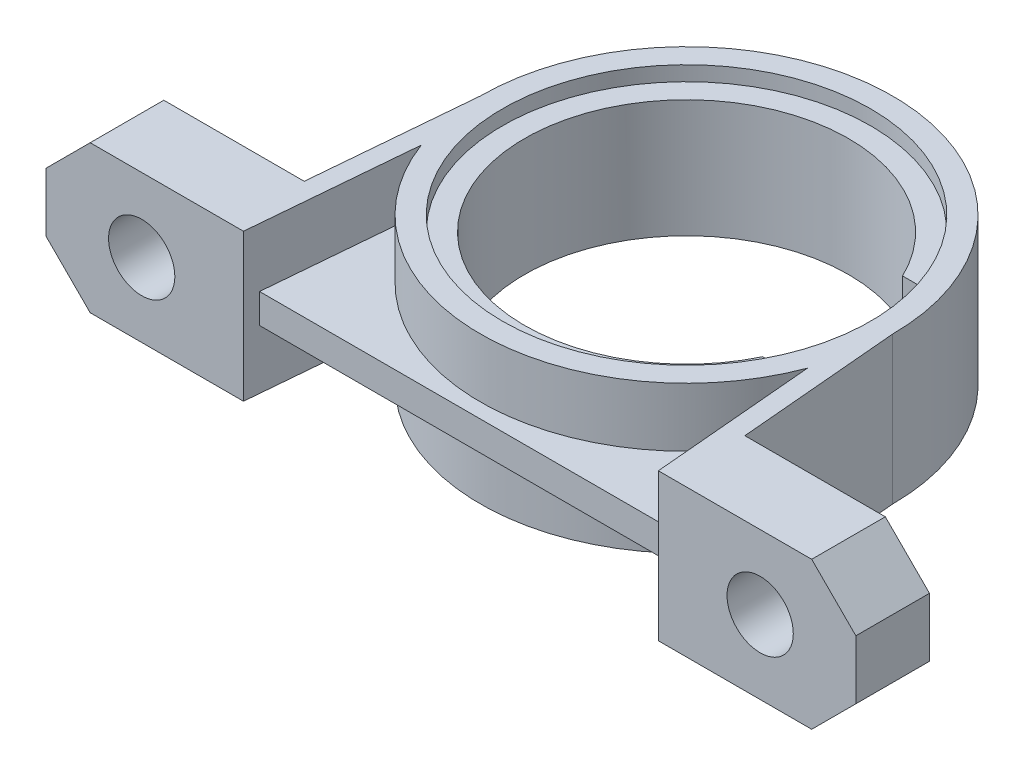
ISO-10303-21;
HEADER;
FILE_DESCRIPTION(('STEP AP214'),'2;1');
FILE_NAME('part.step','',(''),(''),'','','');
FILE_SCHEMA(('AUTOMOTIVE_DESIGN { 1 0 10303 214 1 1 1 1 }'));
ENDSEC;
DATA;
#1=APPLICATION_CONTEXT('core data for automotive mechanical design processes');
#2=APPLICATION_PROTOCOL_DEFINITION('international standard','automotive_design',2000,#1);
#3=PRODUCT_CONTEXT('',#1,'mechanical');
#4=PRODUCT('Part','Part','',(#3));
#5=PRODUCT_RELATED_PRODUCT_CATEGORY('part','',(#4));
#6=PRODUCT_DEFINITION_FORMATION('','',#4);
#7=PRODUCT_DEFINITION_CONTEXT('part definition',#1,'design');
#8=PRODUCT_DEFINITION('design','',#6,#7);
#9=PRODUCT_DEFINITION_SHAPE('','',#8);
#10=(LENGTH_UNIT() NAMED_UNIT(*) SI_UNIT(.MILLI.,.METRE.));
#11=(NAMED_UNIT(*) PLANE_ANGLE_UNIT() SI_UNIT($,.RADIAN.));
#12=(NAMED_UNIT(*) SI_UNIT($,.STERADIAN.) SOLID_ANGLE_UNIT());
#13=UNCERTAINTY_MEASURE_WITH_UNIT(LENGTH_MEASURE(1.E-05),#10,'distance_accuracy_value','');
#14=(GEOMETRIC_REPRESENTATION_CONTEXT(3) GLOBAL_UNCERTAINTY_ASSIGNED_CONTEXT((#13)) GLOBAL_UNIT_ASSIGNED_CONTEXT((#10,
#11,#12)) REPRESENTATION_CONTEXT('',''));
#15=CARTESIAN_POINT('',(0.,0.,0.));
#16=DIRECTION('',(0.,0.,1.));
#17=DIRECTION('',(1.,0.,0.));
#18=AXIS2_PLACEMENT_3D('',#15,#16,#17);
#19=CARTESIAN_POINT('',(-14.,10.,-0.999999999999998));
#20=DIRECTION('',(0.,0.,-1.));
#21=DIRECTION('',(-1.,0.,0.));
#22=AXIS2_PLACEMENT_3D('',#19,#20,#21);
#23=PLANE('',#22);
#24=DIRECTION('',(-1.,0.,0.));
#25=VECTOR('',#24,1.);
#26=CARTESIAN_POINT('',(14.,4.,-0.999999999999998));
#27=LINE('',#26,#25);
#28=CARTESIAN_POINT('',(14.,4.,-0.999999999999998));
#29=VERTEX_POINT('',#28);
#30=CARTESIAN_POINT('',(-14.,4.,-0.999999999999998));
#31=VERTEX_POINT('',#30);
#32=EDGE_CURVE('E213',#29,#31,#27,.T.);
#33=ORIENTED_EDGE('',*,*,#32,.F.);
#34=DIRECTION('',(0.,-1.,0.));
#35=VECTOR('',#34,1.);
#36=CARTESIAN_POINT('',(14.,10.,-0.999999999999998));
#37=LINE('',#36,#35);
#38=CARTESIAN_POINT('',(14.,6.,-0.999999999999998));
#39=VERTEX_POINT('',#38);
#40=EDGE_CURVE('E227',#39,#29,#37,.T.);
#41=ORIENTED_EDGE('',*,*,#40,.F.);
#42=DIRECTION('',(1.,0.,0.));
#43=VECTOR('',#42,1.);
#44=CARTESIAN_POINT('',(-14.,6.,-0.999999999999998));
#45=LINE('',#44,#43);
#46=CARTESIAN_POINT('',(-14.,6.,-0.999999999999998));
#47=VERTEX_POINT('',#46);
#48=EDGE_CURVE('E225',#47,#39,#45,.T.);
#49=ORIENTED_EDGE('',*,*,#48,.F.);
#50=DIRECTION('',(0.,-1.,0.));
#51=VECTOR('',#50,1.);
#52=CARTESIAN_POINT('',(-14.,10.,-0.999999999999998));
#53=LINE('',#52,#51);
#54=EDGE_CURVE('E206',#47,#31,#53,.T.);
#55=ORIENTED_EDGE('',*,*,#54,.T.);
#56=EDGE_LOOP('',(#33,#41,#49,#55));
#57=FACE_BOUND('',#56,.T.);
#58=ADVANCED_FACE('F37',(#57),#23,.F.);
#59=CARTESIAN_POINT('',(0.,0.,-16.));
#60=DIRECTION('',(0.,1.,0.));
#61=DIRECTION('',(0.,0.,1.));
#62=AXIS2_PLACEMENT_3D('',#59,#60,#61);
#63=CYLINDRICAL_SURFACE('',#62,11.);
#64=CARTESIAN_POINT('',(0.,9.,-16.));
#65=DIRECTION('',(0.,1.,0.));
#66=DIRECTION('',(0.,0.,1.));
#67=AXIS2_PLACEMENT_3D('',#64,#65,#66);
#68=CIRCLE('',#67,11.);
#69=CARTESIAN_POINT('',(9.92156741649221,9.,-11.25));
#70=VERTEX_POINT('',#69);
#71=CARTESIAN_POINT('',(9.92156741649221,9.,-20.75));
#72=VERTEX_POINT('',#71);
#73=EDGE_CURVE('E251',#70,#72,#68,.F.);
#74=ORIENTED_EDGE('',*,*,#73,.F.);
#75=DIRECTION('',(0.,1.,0.));
#76=VECTOR('',#75,1.);
#77=CARTESIAN_POINT('',(9.92156741649221,4.,-11.25));
#78=LINE('',#77,#76);
#79=CARTESIAN_POINT('',(9.92156741649221,4.,-11.25));
#80=VERTEX_POINT('',#79);
#81=EDGE_CURVE('E423',#80,#70,#78,.T.);
#82=ORIENTED_EDGE('',*,*,#81,.F.);
#83=CARTESIAN_POINT('',(0.,4.,-16.));
#84=DIRECTION('',(0.,-1.,0.));
#85=DIRECTION('',(0.,0.,-1.));
#86=AXIS2_PLACEMENT_3D('',#83,#84,#85);
#87=CIRCLE('',#86,11.);
#88=CARTESIAN_POINT('',(9.92156741649221,4.,-20.75));
#89=VERTEX_POINT('',#88);
#90=EDGE_CURVE('E414',#89,#80,#87,.T.);
#91=ORIENTED_EDGE('',*,*,#90,.F.);
#92=DIRECTION('',(0.,1.,0.));
#93=VECTOR('',#92,1.);
#94=CARTESIAN_POINT('',(9.92156741649221,4.,-20.75));
#95=LINE('',#94,#93);
#96=EDGE_CURVE('E425',#89,#72,#95,.T.);
#97=ORIENTED_EDGE('',*,*,#96,.T.);
#98=EDGE_LOOP('',(#74,#82,#91,#97));
#99=FACE_BOUND('',#98,.T.);
#100=CARTESIAN_POINT('',(0.,1.,-16.));
#101=DIRECTION('',(0.,-1.,0.));
#102=DIRECTION('',(0.,0.,-1.));
#103=AXIS2_PLACEMENT_3D('',#100,#101,#102);
#104=CIRCLE('',#103,11.);
#105=CARTESIAN_POINT('',(0.,1.,-27.));
#106=VERTEX_POINT('',#105);
#107=EDGE_CURVE('E41',#106,#106,#104,.F.);
#108=ORIENTED_EDGE('',*,*,#107,.F.);
#109=EDGE_LOOP('',(#108));
#110=FACE_BOUND('',#109,.T.);
#111=ADVANCED_FACE('F449',(#99,#110),#63,.F.);
#112=CARTESIAN_POINT('',(27.5,10.,0.));
#113=DIRECTION('',(-1.,0.,0.));
#114=DIRECTION('',(0.,0.,1.));
#115=AXIS2_PLACEMENT_3D('',#112,#113,#114);
#116=PLANE('',#115);
#117=DIRECTION('',(0.,-1.,0.));
#118=VECTOR('',#117,1.);
#119=CARTESIAN_POINT('',(27.5,10.,-5.));
#120=LINE('',#119,#118);
#121=CARTESIAN_POINT('',(27.5,7.00000000000006,-5.00000000000001));
#122=VERTEX_POINT('',#121);
#123=CARTESIAN_POINT('',(27.5,2.99999999999992,-5.00000000000001));
#124=VERTEX_POINT('',#123);
#125=EDGE_CURVE('E11',#122,#124,#120,.T.);
#126=ORIENTED_EDGE('',*,*,#125,.F.);
#127=DIRECTION('',(0.,0.,1.));
#128=VECTOR('',#127,1.);
#129=CARTESIAN_POINT('',(27.5,7.00000000000006,-11.3639610306789));
#130=LINE('',#129,#128);
#131=CARTESIAN_POINT('',(27.5,7.00000000000006,0.));
#132=VERTEX_POINT('',#131);
#133=EDGE_CURVE('E290',#122,#132,#130,.T.);
#134=ORIENTED_EDGE('',*,*,#133,.T.);
#135=DIRECTION('',(0.,-1.,0.));
#136=VECTOR('',#135,1.);
#137=CARTESIAN_POINT('',(27.5,10.,0.));
#138=LINE('',#137,#136);
#139=CARTESIAN_POINT('',(27.5,2.99999999999992,0.));
#140=VERTEX_POINT('',#139);
#141=EDGE_CURVE('E336',#132,#140,#138,.T.);
#142=ORIENTED_EDGE('',*,*,#141,.T.);
#143=DIRECTION('',(0.,0.,1.));
#144=VECTOR('',#143,1.);
#145=CARTESIAN_POINT('',(27.5,2.99999999999992,-11.3639610306789));
#146=LINE('',#145,#144);
#147=EDGE_CURVE('E270',#124,#140,#146,.T.);
#148=ORIENTED_EDGE('',*,*,#147,.F.);
#149=EDGE_LOOP('',(#126,#134,#142,#148));
#150=FACE_BOUND('',#149,.T.);
#151=ADVANCED_FACE('F39',(#150),#116,.F.);
#152=CARTESIAN_POINT('',(14.9623752987852,10.,-5.));
#153=DIRECTION('',(0.,0.,1.));
#154=DIRECTION('',(1.,0.,0.));
#155=AXIS2_PLACEMENT_3D('',#152,#153,#154);
#156=PLANE('',#155);
#157=CARTESIAN_POINT('',(21.,5.,-5.00000000000001));
#158=DIRECTION('',(0.,0.,1.));
#159=DIRECTION('',(1.,0.,0.));
#160=AXIS2_PLACEMENT_3D('',#157,#158,#159);
#161=CIRCLE('',#160,2.25);
#162=CARTESIAN_POINT('',(23.25,5.,-5.00000000000001));
#163=VERTEX_POINT('',#162);
#164=EDGE_CURVE('E295',#163,#163,#161,.F.);
#165=ORIENTED_EDGE('',*,*,#164,.F.);
#166=EDGE_LOOP('',(#165));
#167=FACE_BOUND('',#166,.T.);
#168=DIRECTION('',(-1.,0.,0.));
#169=VECTOR('',#168,1.);
#170=CARTESIAN_POINT('',(14.9623752987852,10.,-5.));
#171=LINE('',#170,#169);
#172=CARTESIAN_POINT('',(24.5,10.,-5.));
#173=VERTEX_POINT('',#172);
#174=CARTESIAN_POINT('',(14.9623752987852,10.,-5.));
#175=VERTEX_POINT('',#174);
#176=EDGE_CURVE('E316',#173,#175,#171,.T.);
#177=ORIENTED_EDGE('',*,*,#176,.F.);
#178=DIRECTION('',(-0.707106781186556,0.707106781186539,0.));
#179=VECTOR('',#178,1.);
#180=CARTESIAN_POINT('',(27.5,7.00000000000006,-5.00000000000001));
#181=LINE('',#180,#179);
#182=EDGE_CURVE('E276',#122,#173,#181,.T.);
#183=ORIENTED_EDGE('',*,*,#182,.F.);
#184=ORIENTED_EDGE('',*,*,#125,.T.);
#185=DIRECTION('',(0.707106781186556,0.707106781186539,0.));
#186=VECTOR('',#185,1.);
#187=CARTESIAN_POINT('',(27.5,2.99999999999992,-5.00000000000001));
#188=LINE('',#187,#186);
#189=CARTESIAN_POINT('',(24.5,0.,-5.00000000000001));
#190=VERTEX_POINT('',#189);
#191=EDGE_CURVE('E253',#190,#124,#188,.T.);
#192=ORIENTED_EDGE('',*,*,#191,.F.);
#193=DIRECTION('',(-1.,0.,0.));
#194=VECTOR('',#193,1.);
#195=CARTESIAN_POINT('',(14.9623752987852,0.,-5.));
#196=LINE('',#195,#194);
#197=CARTESIAN_POINT('',(14.9623752987852,0.,-5.));
#198=VERTEX_POINT('',#197);
#199=EDGE_CURVE('E315',#190,#198,#196,.T.);
#200=ORIENTED_EDGE('',*,*,#199,.T.);
#201=DIRECTION('',(0.,-1.,0.));
#202=VECTOR('',#201,1.);
#203=CARTESIAN_POINT('',(14.9623752987852,10.,-5.));
#204=LINE('',#203,#202);
#205=EDGE_CURVE('E46',#175,#198,#204,.T.);
#206=ORIENTED_EDGE('',*,*,#205,.F.);
#207=EDGE_LOOP('',(#177,#183,#184,#192,#200,#206));
#208=FACE_BOUND('',#207,.T.);
#209=ADVANCED_FACE('F378',(#167,#208),#156,.F.);
#210=CARTESIAN_POINT('',(14.,10.,-16.));
#211=DIRECTION('',(-0.996194698091746,0.,0.0871557427476584));
#212=DIRECTION('',(0.0871557427476584,0.,0.996194698091746));
#213=AXIS2_PLACEMENT_3D('',#210,#211,#212);
#214=PLANE('',#213);
#215=DIRECTION('',(-0.0871557427476584,0.,-0.996194698091745));
#216=VECTOR('',#215,1.);
#217=CARTESIAN_POINT('',(14.,0.,-16.));
#218=LINE('',#217,#216);
#219=CARTESIAN_POINT('',(14.,0.,-16.));
#220=VERTEX_POINT('',#219);
#221=EDGE_CURVE('E338',#198,#220,#218,.T.);
#222=ORIENTED_EDGE('',*,*,#221,.T.);
#223=DIRECTION('',(0.,-1.,0.));
#224=VECTOR('',#223,1.);
#225=CARTESIAN_POINT('',(14.,10.,-16.));
#226=LINE('',#225,#224);
#227=CARTESIAN_POINT('',(14.,10.,-16.));
#228=VERTEX_POINT('',#227);
#229=EDGE_CURVE('E247',#228,#220,#226,.T.);
#230=ORIENTED_EDGE('',*,*,#229,.F.);
#231=DIRECTION('',(-0.0871557427476584,0.,-0.996194698091745));
#232=VECTOR('',#231,1.);
#233=CARTESIAN_POINT('',(14.,10.,-16.));
#234=LINE('',#233,#232);
#235=EDGE_CURVE('E318',#175,#228,#234,.T.);
#236=ORIENTED_EDGE('',*,*,#235,.F.);
#237=ORIENTED_EDGE('',*,*,#205,.T.);
#238=EDGE_LOOP('',(#222,#230,#236,#237));
#239=FACE_BOUND('',#238,.T.);
#240=ADVANCED_FACE('F479',(#239),#214,.F.);
#241=CARTESIAN_POINT('',(0.,10.,-16.));
#242=DIRECTION('',(0.,-1.,0.));
#243=DIRECTION('',(0.,0.,-1.));
#244=AXIS2_PLACEMENT_3D('',#241,#242,#243);
#245=CYLINDRICAL_SURFACE('',#244,14.);
#246=CARTESIAN_POINT('',(0.,0.,-16.));
#247=DIRECTION('',(0.,1.,0.));
#248=DIRECTION('',(0.,0.,1.));
#249=AXIS2_PLACEMENT_3D('',#246,#247,#248);
#250=CIRCLE('',#249,14.);
#251=CARTESIAN_POINT('',(-14.,0.,-16.));
#252=VERTEX_POINT('',#251);
#253=EDGE_CURVE('E340',#220,#252,#250,.T.);
#254=ORIENTED_EDGE('',*,*,#253,.T.);
#255=DIRECTION('',(0.,-1.,0.));
#256=VECTOR('',#255,1.);
#257=CARTESIAN_POINT('',(-14.,10.,-16.));
#258=LINE('',#257,#256);
#259=CARTESIAN_POINT('',(-14.,10.,-16.));
#260=VERTEX_POINT('',#259);
#261=EDGE_CURVE('E244',#260,#252,#258,.T.);
#262=ORIENTED_EDGE('',*,*,#261,.F.);
#263=CARTESIAN_POINT('',(0.,10.,-16.));
#264=DIRECTION('',(0.,1.,0.));
#265=DIRECTION('',(0.,0.,1.));
#266=AXIS2_PLACEMENT_3D('',#263,#264,#265);
#267=CIRCLE('',#266,14.);
#268=EDGE_CURVE('E321',#228,#260,#267,.T.);
#269=ORIENTED_EDGE('',*,*,#268,.F.);
#270=ORIENTED_EDGE('',*,*,#229,.T.);
#271=EDGE_LOOP('',(#254,#262,#269,#270));
#272=FACE_BOUND('',#271,.T.);
#273=ADVANCED_FACE('F475',(#272),#245,.T.);
#274=CARTESIAN_POINT('',(-14.,10.,-16.));
#275=DIRECTION('',(0.996194698091746,0.,0.0871557427476584));
#276=DIRECTION('',(0.0871557427476584,0.,-0.996194698091746));
#277=AXIS2_PLACEMENT_3D('',#274,#275,#276);
#278=PLANE('',#277);
#279=DIRECTION('',(-0.0871557427476584,0.,0.996194698091745));
#280=VECTOR('',#279,1.);
#281=CARTESIAN_POINT('',(-14.,0.,-16.));
#282=LINE('',#281,#280);
#283=CARTESIAN_POINT('',(-14.9623752987852,0.,-5.));
#284=VERTEX_POINT('',#283);
#285=EDGE_CURVE('E342',#252,#284,#282,.T.);
#286=ORIENTED_EDGE('',*,*,#285,.T.);
#287=DIRECTION('',(0.,-1.,0.));
#288=VECTOR('',#287,1.);
#289=CARTESIAN_POINT('',(-14.9623752987852,10.,-5.));
#290=LINE('',#289,#288);
#291=CARTESIAN_POINT('',(-14.9623752987852,10.,-5.));
#292=VERTEX_POINT('',#291);
#293=EDGE_CURVE('E241',#292,#284,#290,.T.);
#294=ORIENTED_EDGE('',*,*,#293,.F.);
#295=DIRECTION('',(-0.0871557427476584,0.,0.996194698091745));
#296=VECTOR('',#295,1.);
#297=CARTESIAN_POINT('',(-14.,10.,-16.));
#298=LINE('',#297,#296);
#299=EDGE_CURVE('E323',#260,#292,#298,.T.);
#300=ORIENTED_EDGE('',*,*,#299,.F.);
#301=ORIENTED_EDGE('',*,*,#261,.T.);
#302=EDGE_LOOP('',(#286,#294,#300,#301));
#303=FACE_BOUND('',#302,.T.);
#304=ADVANCED_FACE('F471',(#303),#278,.F.);
#305=CARTESIAN_POINT('',(-27.5,10.,-5.));
#306=DIRECTION('',(0.,0.,1.));
#307=DIRECTION('',(1.,0.,0.));
#308=AXIS2_PLACEMENT_3D('',#305,#306,#307);
#309=PLANE('',#308);
#310=CARTESIAN_POINT('',(-21.,5.,-5.));
#311=DIRECTION('',(0.,0.,1.));
#312=DIRECTION('',(1.,0.,0.));
#313=AXIS2_PLACEMENT_3D('',#310,#311,#312);
#314=CIRCLE('',#313,2.25);
#315=CARTESIAN_POINT('',(-18.75,5.,-5.));
#316=VERTEX_POINT('',#315);
#317=EDGE_CURVE('E312',#316,#316,#314,.F.);
#318=ORIENTED_EDGE('',*,*,#317,.F.);
#319=EDGE_LOOP('',(#318));
#320=FACE_BOUND('',#319,.T.);
#321=DIRECTION('',(0.,-1.,0.));
#322=VECTOR('',#321,1.);
#323=CARTESIAN_POINT('',(-27.5,10.,-5.));
#324=LINE('',#323,#322);
#325=CARTESIAN_POINT('',(-27.5,7.00000000000006,-5.));
#326=VERTEX_POINT('',#325);
#327=CARTESIAN_POINT('',(-27.5,2.99999999999992,-5.));
#328=VERTEX_POINT('',#327);
#329=EDGE_CURVE('E238',#326,#328,#324,.T.);
#330=ORIENTED_EDGE('',*,*,#329,.F.);
#331=DIRECTION('',(-0.707106781186556,-0.707106781186539,0.));
#332=VECTOR('',#331,1.);
#333=CARTESIAN_POINT('',(-27.5,7.00000000000007,-5.));
#334=LINE('',#333,#332);
#335=CARTESIAN_POINT('',(-24.5,9.99999999999999,-5.));
#336=VERTEX_POINT('',#335);
#337=EDGE_CURVE('E283',#336,#326,#334,.T.);
#338=ORIENTED_EDGE('',*,*,#337,.F.);
#339=DIRECTION('',(-1.,0.,0.));
#340=VECTOR('',#339,1.);
#341=CARTESIAN_POINT('',(-27.5,10.,-5.));
#342=LINE('',#341,#340);
#343=EDGE_CURVE('E325',#292,#336,#342,.T.);
#344=ORIENTED_EDGE('',*,*,#343,.F.);
#345=ORIENTED_EDGE('',*,*,#293,.T.);
#346=DIRECTION('',(-1.,0.,0.));
#347=VECTOR('',#346,1.);
#348=CARTESIAN_POINT('',(-27.5,0.,-5.));
#349=LINE('',#348,#347);
#350=CARTESIAN_POINT('',(-24.5,0.,-5.));
#351=VERTEX_POINT('',#350);
#352=EDGE_CURVE('E344',#284,#351,#349,.T.);
#353=ORIENTED_EDGE('',*,*,#352,.T.);
#354=DIRECTION('',(0.707106781186557,-0.707106781186538,0.));
#355=VECTOR('',#354,1.);
#356=CARTESIAN_POINT('',(-27.5,2.99999999999992,-5.));
#357=LINE('',#356,#355);
#358=EDGE_CURVE('E285',#328,#351,#357,.T.);
#359=ORIENTED_EDGE('',*,*,#358,.F.);
#360=EDGE_LOOP('',(#330,#338,#344,#345,#353,#359));
#361=FACE_BOUND('',#360,.T.);
#362=ADVANCED_FACE('F467',(#320,#361),#309,.F.);
#363=CARTESIAN_POINT('',(-27.5,10.,0.));
#364=DIRECTION('',(1.,0.,0.));
#365=DIRECTION('',(0.,0.,-1.));
#366=AXIS2_PLACEMENT_3D('',#363,#364,#365);
#367=PLANE('',#366);
#368=DIRECTION('',(0.,-1.,0.));
#369=VECTOR('',#368,1.);
#370=CARTESIAN_POINT('',(-27.5,10.,0.));
#371=LINE('',#370,#369);
#372=CARTESIAN_POINT('',(-27.5,7.00000000000006,0.));
#373=VERTEX_POINT('',#372);
#374=CARTESIAN_POINT('',(-27.5,2.99999999999992,0.));
#375=VERTEX_POINT('',#374);
#376=EDGE_CURVE('E230',#373,#375,#371,.T.);
#377=ORIENTED_EDGE('',*,*,#376,.F.);
#378=DIRECTION('',(0.,0.,1.));
#379=VECTOR('',#378,1.);
#380=CARTESIAN_POINT('',(-27.5,7.00000000000006,-11.3639610306789));
#381=LINE('',#380,#379);
#382=EDGE_CURVE('E277',#326,#373,#381,.T.);
#383=ORIENTED_EDGE('',*,*,#382,.F.);
#384=ORIENTED_EDGE('',*,*,#329,.T.);
#385=DIRECTION('',(0.,0.,1.));
#386=VECTOR('',#385,1.);
#387=CARTESIAN_POINT('',(-27.5,2.99999999999992,-11.3639610306789));
#388=LINE('',#387,#386);
#389=EDGE_CURVE('E305',#328,#375,#388,.T.);
#390=ORIENTED_EDGE('',*,*,#389,.T.);
#391=EDGE_LOOP('',(#377,#383,#384,#390));
#392=FACE_BOUND('',#391,.T.);
#393=ADVANCED_FACE('F463',(#392),#367,.F.);
#394=CARTESIAN_POINT('',(-14.0874886635259,10.,0.));
#395=DIRECTION('',(0.,0.,-1.));
#396=DIRECTION('',(-1.,0.,0.));
#397=AXIS2_PLACEMENT_3D('',#394,#395,#396);
#398=PLANE('',#397);
#399=CARTESIAN_POINT('',(-21.,5.,0.));
#400=DIRECTION('',(0.,0.,1.));
#401=DIRECTION('',(1.,0.,0.));
#402=AXIS2_PLACEMENT_3D('',#399,#400,#401);
#403=CIRCLE('',#402,2.25);
#404=CARTESIAN_POINT('',(-18.75,5.,0.));
#405=VERTEX_POINT('',#404);
#406=EDGE_CURVE('E302',#405,#405,#403,.T.);
#407=ORIENTED_EDGE('',*,*,#406,.F.);
#408=EDGE_LOOP('',(#407));
#409=FACE_BOUND('',#408,.T.);
#410=DIRECTION('',(1.,0.,0.));
#411=VECTOR('',#410,1.);
#412=CARTESIAN_POINT('',(-14.0874886635259,10.,0.));
#413=LINE('',#412,#411);
#414=CARTESIAN_POINT('',(-24.5,10.,0.));
#415=VERTEX_POINT('',#414);
#416=CARTESIAN_POINT('',(-14.0874886635259,10.,0.));
#417=VERTEX_POINT('',#416);
#418=EDGE_CURVE('E328',#415,#417,#413,.T.);
#419=ORIENTED_EDGE('',*,*,#418,.F.);
#420=DIRECTION('',(0.707106781186556,0.707106781186539,0.));
#421=VECTOR('',#420,1.);
#422=CARTESIAN_POINT('',(-27.5,7.00000000000006,0.));
#423=LINE('',#422,#421);
#424=EDGE_CURVE('E279',#373,#415,#423,.T.);
#425=ORIENTED_EDGE('',*,*,#424,.F.);
#426=ORIENTED_EDGE('',*,*,#376,.T.);
#427=DIRECTION('',(-0.707106781186557,0.707106781186538,0.));
#428=VECTOR('',#427,1.);
#429=CARTESIAN_POINT('',(-27.5,2.99999999999992,0.));
#430=LINE('',#429,#428);
#431=CARTESIAN_POINT('',(-24.5,0.,0.));
#432=VERTEX_POINT('',#431);
#433=EDGE_CURVE('E299',#432,#375,#430,.T.);
#434=ORIENTED_EDGE('',*,*,#433,.F.);
#435=DIRECTION('',(1.,0.,0.));
#436=VECTOR('',#435,1.);
#437=CARTESIAN_POINT('',(-14.0874886635259,0.,0.));
#438=LINE('',#437,#436);
#439=CARTESIAN_POINT('',(-14.0874886635259,0.,0.));
#440=VERTEX_POINT('',#439);
#441=EDGE_CURVE('E347',#432,#440,#438,.T.);
#442=ORIENTED_EDGE('',*,*,#441,.T.);
#443=DIRECTION('',(0.,-1.,0.));
#444=VECTOR('',#443,1.);
#445=CARTESIAN_POINT('',(-14.0874886635259,10.,0.));
#446=LINE('',#445,#444);
#447=EDGE_CURVE('E226',#417,#440,#446,.T.);
#448=ORIENTED_EDGE('',*,*,#447,.F.);
#449=EDGE_LOOP('',(#419,#425,#426,#434,#442,#448));
#450=FACE_BOUND('',#449,.T.);
#451=ADVANCED_FACE('F460',(#409,#450),#398,.F.);
#452=CARTESIAN_POINT('',(-14.,10.,-0.999999999999998));
#453=DIRECTION('',(-0.996194698091746,0.,-0.0871557427476578));
#454=DIRECTION('',(-0.0871557427476578,0.,0.996194698091746));
#455=AXIS2_PLACEMENT_3D('',#452,#453,#454);
#456=PLANE('',#455);
#457=DIRECTION('',(0.0871557427476578,0.,-0.996194698091746));
#458=VECTOR('',#457,1.);
#459=CARTESIAN_POINT('',(-14.,0.,-0.999999999999998));
#460=LINE('',#459,#458);
#461=CARTESIAN_POINT('',(-13.116009813439,0.,-11.1040540675196));
#462=VERTEX_POINT('',#461);
#463=EDGE_CURVE('E349',#440,#462,#460,.T.);
#464=ORIENTED_EDGE('',*,*,#463,.T.);
#465=DIRECTION('',(0.,-1.,0.));
#466=VECTOR('',#465,1.);
#467=CARTESIAN_POINT('',(-13.116009813439,4.,-11.1040540675196));
#468=LINE('',#467,#466);
#469=CARTESIAN_POINT('',(-13.116009813439,4.,-11.1040540675196));
#470=VERTEX_POINT('',#469);
#471=EDGE_CURVE('E208',#470,#462,#468,.T.);
#472=ORIENTED_EDGE('',*,*,#471,.F.);
#473=DIRECTION('',(0.0871557427476576,0.,-0.996194698091746));
#474=VECTOR('',#473,1.);
#475=CARTESIAN_POINT('',(-14.,4.,-0.999999999999998));
#476=LINE('',#475,#474);
#477=EDGE_CURVE('E201',#31,#470,#476,.T.);
#478=ORIENTED_EDGE('',*,*,#477,.F.);
#479=ORIENTED_EDGE('',*,*,#54,.F.);
#480=DIRECTION('',(-0.087155742747658,0.,0.996194698091746));
#481=VECTOR('',#480,1.);
#482=CARTESIAN_POINT('',(-14.,6.,-0.999999999999998));
#483=LINE('',#482,#481);
#484=CARTESIAN_POINT('',(-13.116009813439,6.,-11.1040540675196));
#485=VERTEX_POINT('',#484);
#486=EDGE_CURVE('E804',#485,#47,#483,.T.);
#487=ORIENTED_EDGE('',*,*,#486,.F.);
#488=DIRECTION('',(0.,1.,0.));
#489=VECTOR('',#488,1.);
#490=CARTESIAN_POINT('',(-13.116009813439,6.,-11.1040540675196));
#491=LINE('',#490,#489);
#492=CARTESIAN_POINT('',(-13.116009813439,10.,-11.1040540675196));
#493=VERTEX_POINT('',#492);
#494=EDGE_CURVE('E400',#485,#493,#491,.T.);
#495=ORIENTED_EDGE('',*,*,#494,.T.);
#496=DIRECTION('',(0.0871557427476578,0.,-0.996194698091746));
#497=VECTOR('',#496,1.);
#498=CARTESIAN_POINT('',(-14.,10.,-0.999999999999998));
#499=LINE('',#498,#497);
#500=EDGE_CURVE('E54',#417,#493,#499,.T.);
#501=ORIENTED_EDGE('',*,*,#500,.F.);
#502=ORIENTED_EDGE('',*,*,#447,.T.);
#503=EDGE_LOOP('',(#464,#472,#478,#479,#487,#495,#501,#502));
#504=FACE_BOUND('',#503,.T.);
#505=ADVANCED_FACE('F203',(#504),#456,.F.);
#506=CARTESIAN_POINT('',(14.,10.,-0.999999999999998));
#507=DIRECTION('',(0.996194698091746,0.,-0.0871557427476579));
#508=DIRECTION('',(-0.0871557427476579,0.,-0.996194698091746));
#509=AXIS2_PLACEMENT_3D('',#506,#507,#508);
#510=PLANE('',#509);
#511=DIRECTION('',(0.0871557427476579,0.,0.996194698091746));
#512=VECTOR('',#511,1.);
#513=CARTESIAN_POINT('',(14.,0.,-0.999999999999998));
#514=LINE('',#513,#512);
#515=CARTESIAN_POINT('',(13.116009813439,0.,-11.1040540675196));
#516=VERTEX_POINT('',#515);
#517=CARTESIAN_POINT('',(14.0874886635259,0.,0.));
#518=VERTEX_POINT('',#517);
#519=EDGE_CURVE('E351',#516,#518,#514,.T.);
#520=ORIENTED_EDGE('',*,*,#519,.T.);
#521=DIRECTION('',(0.,-1.,0.));
#522=VECTOR('',#521,1.);
#523=CARTESIAN_POINT('',(14.0874886635259,10.,0.));
#524=LINE('',#523,#522);
#525=CARTESIAN_POINT('',(14.0874886635259,10.,0.));
#526=VERTEX_POINT('',#525);
#527=EDGE_CURVE('E232',#526,#518,#524,.T.);
#528=ORIENTED_EDGE('',*,*,#527,.F.);
#529=DIRECTION('',(0.0871557427476579,0.,0.996194698091746));
#530=VECTOR('',#529,1.);
#531=CARTESIAN_POINT('',(14.,10.,-0.999999999999998));
#532=LINE('',#531,#530);
#533=CARTESIAN_POINT('',(13.116009813439,10.,-11.1040540675196));
#534=VERTEX_POINT('',#533);
#535=EDGE_CURVE('E331',#534,#526,#532,.T.);
#536=ORIENTED_EDGE('',*,*,#535,.F.);
#537=DIRECTION('',(0.,1.,0.));
#538=VECTOR('',#537,1.);
#539=CARTESIAN_POINT('',(13.116009813439,6.,-11.1040540675196));
#540=LINE('',#539,#538);
#541=CARTESIAN_POINT('',(13.116009813439,6.,-11.1040540675196));
#542=VERTEX_POINT('',#541);
#543=EDGE_CURVE('E391',#542,#534,#540,.T.);
#544=ORIENTED_EDGE('',*,*,#543,.F.);
#545=DIRECTION('',(-0.0871557427476582,0.,-0.996194698091746));
#546=VECTOR('',#545,1.);
#547=CARTESIAN_POINT('',(14.,6.,-0.999999999999998));
#548=LINE('',#547,#546);
#549=EDGE_CURVE('E403',#39,#542,#548,.T.);
#550=ORIENTED_EDGE('',*,*,#549,.F.);
#551=ORIENTED_EDGE('',*,*,#40,.T.);
#552=DIRECTION('',(0.0871557427476582,0.,0.996194698091746));
#553=VECTOR('',#552,1.);
#554=CARTESIAN_POINT('',(13.116009813439,4.,-11.1040540675196));
#555=LINE('',#554,#553);
#556=CARTESIAN_POINT('',(13.116009813439,4.,-11.1040540675196));
#557=VERTEX_POINT('',#556);
#558=EDGE_CURVE('E218',#557,#29,#555,.T.);
#559=ORIENTED_EDGE('',*,*,#558,.F.);
#560=DIRECTION('',(0.,-1.,0.));
#561=VECTOR('',#560,1.);
#562=CARTESIAN_POINT('',(13.116009813439,4.,-11.1040540675196));
#563=LINE('',#562,#561);
#564=EDGE_CURVE('E795',#557,#516,#563,.T.);
#565=ORIENTED_EDGE('',*,*,#564,.T.);
#566=EDGE_LOOP('',(#520,#528,#536,#544,#550,#551,#559,#565));
#567=FACE_BOUND('',#566,.T.);
#568=ADVANCED_FACE('F389',(#567),#510,.F.);
#569=CARTESIAN_POINT('',(14.0874886635259,10.,0.));
#570=DIRECTION('',(0.,0.,-1.));
#571=DIRECTION('',(-1.,0.,0.));
#572=AXIS2_PLACEMENT_3D('',#569,#570,#571);
#573=PLANE('',#572);
#574=CARTESIAN_POINT('',(21.,5.,0.));
#575=DIRECTION('',(0.,0.,1.));
#576=DIRECTION('',(1.,0.,0.));
#577=AXIS2_PLACEMENT_3D('',#574,#575,#576);
#578=CIRCLE('',#577,2.25);
#579=CARTESIAN_POINT('',(23.25,5.,0.));
#580=VERTEX_POINT('',#579);
#581=EDGE_CURVE('E298',#580,#580,#578,.T.);
#582=ORIENTED_EDGE('',*,*,#581,.F.);
#583=EDGE_LOOP('',(#582));
#584=FACE_BOUND('',#583,.T.);
#585=ORIENTED_EDGE('',*,*,#141,.F.);
#586=DIRECTION('',(0.707106781186556,-0.707106781186539,0.));
#587=VECTOR('',#586,1.);
#588=CARTESIAN_POINT('',(27.5,7.00000000000006,0.));
#589=LINE('',#588,#587);
#590=CARTESIAN_POINT('',(24.5,9.99999999999999,0.));
#591=VERTEX_POINT('',#590);
#592=EDGE_CURVE('E287',#591,#132,#589,.T.);
#593=ORIENTED_EDGE('',*,*,#592,.F.);
#594=DIRECTION('',(1.,0.,0.));
#595=VECTOR('',#594,1.);
#596=CARTESIAN_POINT('',(14.0874886635259,10.,0.));
#597=LINE('',#596,#595);
#598=EDGE_CURVE('E333',#526,#591,#597,.T.);
#599=ORIENTED_EDGE('',*,*,#598,.F.);
#600=ORIENTED_EDGE('',*,*,#527,.T.);
#601=DIRECTION('',(1.,0.,0.));
#602=VECTOR('',#601,1.);
#603=CARTESIAN_POINT('',(14.0874886635259,0.,0.));
#604=LINE('',#603,#602);
#605=CARTESIAN_POINT('',(24.5,0.,0.));
#606=VERTEX_POINT('',#605);
#607=EDGE_CURVE('E319',#518,#606,#604,.T.);
#608=ORIENTED_EDGE('',*,*,#607,.T.);
#609=DIRECTION('',(-0.707106781186556,-0.707106781186539,0.));
#610=VECTOR('',#609,1.);
#611=CARTESIAN_POINT('',(27.5,2.99999999999992,0.));
#612=LINE('',#611,#610);
#613=EDGE_CURVE('E272',#140,#606,#612,.T.);
#614=ORIENTED_EDGE('',*,*,#613,.F.);
#615=EDGE_LOOP('',(#585,#593,#599,#600,#608,#614));
#616=FACE_BOUND('',#615,.T.);
#617=ADVANCED_FACE('F362',(#584,#616),#573,.F.);
#618=CARTESIAN_POINT('',(0.,10.,-16.));
#619=DIRECTION('',(0.,1.,0.));
#620=DIRECTION('',(0.,0.,1.));
#621=AXIS2_PLACEMENT_3D('',#618,#619,#620);
#622=PLANE('',#621);
#623=CARTESIAN_POINT('',(0.,10.,-16.));
#624=DIRECTION('',(0.,-1.,0.));
#625=DIRECTION('',(0.,0.,1.));
#626=AXIS2_PLACEMENT_3D('',#623,#624,#625);
#627=CIRCLE('',#626,14.);
#628=EDGE_CURVE('E387',#534,#493,#627,.T.);
#629=ORIENTED_EDGE('',*,*,#628,.F.);
#630=ORIENTED_EDGE('',*,*,#535,.T.);
#631=ORIENTED_EDGE('',*,*,#598,.T.);
#632=DIRECTION('',(0.,0.,1.));
#633=VECTOR('',#632,1.);
#634=CARTESIAN_POINT('',(24.5,9.99999999999999,-11.3639610306789));
#635=LINE('',#634,#633);
#636=EDGE_CURVE('E288',#173,#591,#635,.T.);
#637=ORIENTED_EDGE('',*,*,#636,.F.);
#638=ORIENTED_EDGE('',*,*,#176,.T.);
#639=ORIENTED_EDGE('',*,*,#235,.T.);
#640=ORIENTED_EDGE('',*,*,#268,.T.);
#641=ORIENTED_EDGE('',*,*,#299,.T.);
#642=ORIENTED_EDGE('',*,*,#343,.T.);
#643=DIRECTION('',(0.,0.,1.));
#644=VECTOR('',#643,1.);
#645=CARTESIAN_POINT('',(-24.5,9.99999999999999,-11.3639610306789));
#646=LINE('',#645,#644);
#647=EDGE_CURVE('E280',#336,#415,#646,.T.);
#648=ORIENTED_EDGE('',*,*,#647,.T.);
#649=ORIENTED_EDGE('',*,*,#418,.T.);
#650=ORIENTED_EDGE('',*,*,#500,.T.);
#651=EDGE_LOOP('',(#629,#630,#631,#637,#638,#639,#640,#641,#642,#648,#649,#650));
#652=FACE_BOUND('',#651,.T.);
#653=CARTESIAN_POINT('',(0.,10.,-16.));
#654=DIRECTION('',(0.,1.,0.));
#655=DIRECTION('',(0.,0.,1.));
#656=AXIS2_PLACEMENT_3D('',#653,#654,#655);
#657=CIRCLE('',#656,12.5);
#658=CARTESIAN_POINT('',(0.,10.,-3.5));
#659=VERTEX_POINT('',#658);
#660=EDGE_CURVE('E261',#659,#659,#657,.T.);
#661=ORIENTED_EDGE('',*,*,#660,.F.);
#662=EDGE_LOOP('',(#661));
#663=FACE_BOUND('',#662,.T.);
#664=ADVANCED_FACE('F385',(#652,#663),#622,.T.);
#665=CARTESIAN_POINT('',(0.,0.,-16.));
#666=DIRECTION('',(0.,1.,0.));
#667=DIRECTION('',(0.,0.,1.));
#668=AXIS2_PLACEMENT_3D('',#665,#666,#667);
#669=PLANE('',#668);
#670=CARTESIAN_POINT('',(0.,0.,-16.));
#671=DIRECTION('',(0.,-1.,0.));
#672=DIRECTION('',(0.,0.,-1.));
#673=AXIS2_PLACEMENT_3D('',#670,#671,#672);
#674=CIRCLE('',#673,12.5);
#675=CARTESIAN_POINT('',(0.,0.,-28.5));
#676=VERTEX_POINT('',#675);
#677=EDGE_CURVE('E267',#676,#676,#674,.T.);
#678=ORIENTED_EDGE('',*,*,#677,.F.);
#679=EDGE_LOOP('',(#678));
#680=FACE_BOUND('',#679,.T.);
#681=ORIENTED_EDGE('',*,*,#519,.F.);
#682=CARTESIAN_POINT('',(0.,0.,-16.));
#683=DIRECTION('',(0.,1.,0.));
#684=DIRECTION('',(0.,0.,-1.));
#685=AXIS2_PLACEMENT_3D('',#682,#683,#684);
#686=CIRCLE('',#685,14.);
#687=EDGE_CURVE('E222',#462,#516,#686,.T.);
#688=ORIENTED_EDGE('',*,*,#687,.F.);
#689=ORIENTED_EDGE('',*,*,#463,.F.);
#690=ORIENTED_EDGE('',*,*,#441,.F.);
#691=DIRECTION('',(0.,0.,1.));
#692=VECTOR('',#691,1.);
#693=CARTESIAN_POINT('',(-24.5,0.,-11.3639610306789));
#694=LINE('',#693,#692);
#695=EDGE_CURVE('E303',#351,#432,#694,.T.);
#696=ORIENTED_EDGE('',*,*,#695,.F.);
#697=ORIENTED_EDGE('',*,*,#352,.F.);
#698=ORIENTED_EDGE('',*,*,#285,.F.);
#699=ORIENTED_EDGE('',*,*,#253,.F.);
#700=ORIENTED_EDGE('',*,*,#221,.F.);
#701=ORIENTED_EDGE('',*,*,#199,.F.);
#702=DIRECTION('',(0.,0.,1.));
#703=VECTOR('',#702,1.);
#704=CARTESIAN_POINT('',(24.5,0.,-11.3639610306789));
#705=LINE('',#704,#703);
#706=EDGE_CURVE('E258',#190,#606,#705,.T.);
#707=ORIENTED_EDGE('',*,*,#706,.T.);
#708=ORIENTED_EDGE('',*,*,#607,.F.);
#709=EDGE_LOOP('',(#681,#688,#689,#690,#696,#697,#698,#699,#700,#701,#707,#708));
#710=FACE_BOUND('',#709,.T.);
#711=ADVANCED_FACE('F367',(#680,#710),#669,.F.);
#712=CARTESIAN_POINT('',(27.5,2.99999999999992,-11.3639610306789));
#713=DIRECTION('',(-0.707106781186539,0.707106781186556,0.));
#714=DIRECTION('',(-0.707106781186556,-0.707106781186539,0.));
#715=AXIS2_PLACEMENT_3D('',#712,#713,#714);
#716=PLANE('',#715);
#717=ORIENTED_EDGE('',*,*,#191,.T.);
#718=ORIENTED_EDGE('',*,*,#147,.T.);
#719=ORIENTED_EDGE('',*,*,#613,.T.);
#720=ORIENTED_EDGE('',*,*,#706,.F.);
#721=EDGE_LOOP('',(#717,#718,#719,#720));
#722=FACE_BOUND('',#721,.T.);
#723=ADVANCED_FACE('F374',(#722),#716,.F.);
#724=CARTESIAN_POINT('',(-27.5,2.99999999999992,-11.3639610306789));
#725=DIRECTION('',(0.707106781186538,0.707106781186557,0.));
#726=DIRECTION('',(-0.707106781186557,0.707106781186538,0.));
#727=AXIS2_PLACEMENT_3D('',#724,#725,#726);
#728=PLANE('',#727);
#729=ORIENTED_EDGE('',*,*,#358,.T.);
#730=ORIENTED_EDGE('',*,*,#695,.T.);
#731=ORIENTED_EDGE('',*,*,#433,.T.);
#732=ORIENTED_EDGE('',*,*,#389,.F.);
#733=EDGE_LOOP('',(#729,#730,#731,#732));
#734=FACE_BOUND('',#733,.T.);
#735=ADVANCED_FACE('F444',(#734),#728,.F.);
#736=CARTESIAN_POINT('',(-27.5,7.00000000000006,-11.3639610306789));
#737=DIRECTION('',(0.707106781186539,-0.707106781186556,0.));
#738=DIRECTION('',(0.707106781186556,0.707106781186539,0.));
#739=AXIS2_PLACEMENT_3D('',#736,#737,#738);
#740=PLANE('',#739);
#741=ORIENTED_EDGE('',*,*,#337,.T.);
#742=ORIENTED_EDGE('',*,*,#382,.T.);
#743=ORIENTED_EDGE('',*,*,#424,.T.);
#744=ORIENTED_EDGE('',*,*,#647,.F.);
#745=EDGE_LOOP('',(#741,#742,#743,#744));
#746=FACE_BOUND('',#745,.T.);
#747=ADVANCED_FACE('F618',(#746),#740,.F.);
#748=CARTESIAN_POINT('',(27.5,7.00000000000006,-11.3639610306789));
#749=DIRECTION('',(-0.707106781186539,-0.707106781186556,0.));
#750=DIRECTION('',(0.707106781186556,-0.707106781186539,0.));
#751=AXIS2_PLACEMENT_3D('',#748,#749,#750);
#752=PLANE('',#751);
#753=ORIENTED_EDGE('',*,*,#182,.T.);
#754=ORIENTED_EDGE('',*,*,#636,.T.);
#755=ORIENTED_EDGE('',*,*,#592,.T.);
#756=ORIENTED_EDGE('',*,*,#133,.F.);
#757=EDGE_LOOP('',(#753,#754,#755,#756));
#758=FACE_BOUND('',#757,.T.);
#759=ADVANCED_FACE('F494',(#758),#752,.F.);
#760=CARTESIAN_POINT('',(21.,5.,-11.3639610306789));
#761=DIRECTION('',(0.,0.,1.));
#762=DIRECTION('',(1.,0.,0.));
#763=AXIS2_PLACEMENT_3D('',#760,#761,#762);
#764=CYLINDRICAL_SURFACE('',#763,2.25);
#765=ORIENTED_EDGE('',*,*,#164,.T.);
#766=EDGE_LOOP('',(#765));
#767=FACE_BOUND('',#766,.T.);
#768=ORIENTED_EDGE('',*,*,#581,.T.);
#769=EDGE_LOOP('',(#768));
#770=FACE_BOUND('',#769,.T.);
#771=ADVANCED_FACE('F490',(#767,#770),#764,.F.);
#772=CARTESIAN_POINT('',(-21.,5.,-11.3639610306789));
#773=DIRECTION('',(0.,0.,1.));
#774=DIRECTION('',(1.,0.,0.));
#775=AXIS2_PLACEMENT_3D('',#772,#773,#774);
#776=CYLINDRICAL_SURFACE('',#775,2.25);
#777=ORIENTED_EDGE('',*,*,#317,.T.);
#778=EDGE_LOOP('',(#777));
#779=FACE_BOUND('',#778,.T.);
#780=ORIENTED_EDGE('',*,*,#406,.T.);
#781=EDGE_LOOP('',(#780));
#782=FACE_BOUND('',#781,.T.);
#783=ADVANCED_FACE('F493',(#779,#782),#776,.F.);
#784=CARTESIAN_POINT('',(0.,9.,-16.));
#785=DIRECTION('',(0.,1.,0.));
#786=DIRECTION('',(0.,0.,1.));
#787=AXIS2_PLACEMENT_3D('',#784,#785,#786);
#788=PLANE('',#787);
#789=DIRECTION('',(1.,0.,0.));
#790=VECTOR('',#789,1.);
#791=CARTESIAN_POINT('',(9.92156741649221,9.,-11.25));
#792=LINE('',#791,#790);
#793=CARTESIAN_POINT('',(11.5623310798472,9.,-11.25));
#794=VERTEX_POINT('',#793);
#795=EDGE_CURVE('E62',#70,#794,#792,.T.);
#796=ORIENTED_EDGE('',*,*,#795,.F.);
#797=ORIENTED_EDGE('',*,*,#73,.T.);
#798=DIRECTION('',(-1.,0.,0.));
#799=VECTOR('',#798,1.);
#800=CARTESIAN_POINT('',(11.5623310798472,9.,-20.75));
#801=LINE('',#800,#799);
#802=CARTESIAN_POINT('',(11.5623310798472,9.,-20.75));
#803=VERTEX_POINT('',#802);
#804=EDGE_CURVE('E399',#803,#72,#801,.T.);
#805=ORIENTED_EDGE('',*,*,#804,.F.);
#806=CARTESIAN_POINT('',(0.,9.,-16.));
#807=DIRECTION('',(0.,1.,0.));
#808=DIRECTION('',(0.,0.,1.));
#809=AXIS2_PLACEMENT_3D('',#806,#807,#808);
#810=CIRCLE('',#809,12.5);
#811=EDGE_CURVE('E254',#803,#794,#810,.T.);
#812=ORIENTED_EDGE('',*,*,#811,.T.);
#813=EDGE_LOOP('',(#796,#797,#805,#812));
#814=FACE_BOUND('',#813,.T.);
#815=ADVANCED_FACE('F655',(#814),#788,.T.);
#816=CARTESIAN_POINT('',(0.,9.,-16.));
#817=DIRECTION('',(0.,1.,0.));
#818=DIRECTION('',(0.,0.,1.));
#819=AXIS2_PLACEMENT_3D('',#816,#817,#818);
#820=CYLINDRICAL_SURFACE('',#819,12.5);
#821=ORIENTED_EDGE('',*,*,#811,.F.);
#822=DIRECTION('',(0.,1.,0.));
#823=VECTOR('',#822,1.);
#824=CARTESIAN_POINT('',(11.5623310798472,4.,-20.75));
#825=LINE('',#824,#823);
#826=CARTESIAN_POINT('',(11.5623310798472,4.,-20.75));
#827=VERTEX_POINT('',#826);
#828=EDGE_CURVE('E418',#827,#803,#825,.T.);
#829=ORIENTED_EDGE('',*,*,#828,.F.);
#830=CARTESIAN_POINT('',(0.,4.,-16.));
#831=DIRECTION('',(0.,1.,0.));
#832=DIRECTION('',(0.,0.,-1.));
#833=AXIS2_PLACEMENT_3D('',#830,#831,#832);
#834=CIRCLE('',#833,12.5);
#835=CARTESIAN_POINT('',(11.5623310798472,4.,-11.25));
#836=VERTEX_POINT('',#835);
#837=EDGE_CURVE('E408',#836,#827,#834,.T.);
#838=ORIENTED_EDGE('',*,*,#837,.F.);
#839=DIRECTION('',(0.,1.,0.));
#840=VECTOR('',#839,1.);
#841=CARTESIAN_POINT('',(11.5623310798472,4.,-11.25));
#842=LINE('',#841,#840);
#843=EDGE_CURVE('E421',#836,#794,#842,.T.);
#844=ORIENTED_EDGE('',*,*,#843,.T.);
#845=EDGE_LOOP('',(#821,#829,#838,#844));
#846=FACE_BOUND('',#845,.T.);
#847=ORIENTED_EDGE('',*,*,#660,.T.);
#848=EDGE_LOOP('',(#847));
#849=FACE_BOUND('',#848,.T.);
#850=ADVANCED_FACE('F667',(#846,#849),#820,.F.);
#851=CARTESIAN_POINT('',(0.,1.,-16.));
#852=DIRECTION('',(0.,-1.,0.));
#853=DIRECTION('',(0.,0.,-1.));
#854=AXIS2_PLACEMENT_3D('',#851,#852,#853);
#855=PLANE('',#854);
#856=CARTESIAN_POINT('',(0.,1.,-16.));
#857=DIRECTION('',(0.,-1.,0.));
#858=DIRECTION('',(0.,0.,-1.));
#859=AXIS2_PLACEMENT_3D('',#856,#857,#858);
#860=CIRCLE('',#859,12.5);
#861=CARTESIAN_POINT('',(0.,1.,-28.5));
#862=VERTEX_POINT('',#861);
#863=EDGE_CURVE('E428',#862,#862,#860,.T.);
#864=ORIENTED_EDGE('',*,*,#863,.T.);
#865=EDGE_LOOP('',(#864));
#866=FACE_BOUND('',#865,.T.);
#867=ORIENTED_EDGE('',*,*,#107,.T.);
#868=EDGE_LOOP('',(#867));
#869=FACE_BOUND('',#868,.T.);
#870=ADVANCED_FACE('F679',(#866,#869),#855,.T.);
#871=CARTESIAN_POINT('',(0.,1.,-16.));
#872=DIRECTION('',(0.,-1.,0.));
#873=DIRECTION('',(0.,0.,-1.));
#874=AXIS2_PLACEMENT_3D('',#871,#872,#873);
#875=CYLINDRICAL_SURFACE('',#874,12.5);
#876=ORIENTED_EDGE('',*,*,#863,.F.);
#877=EDGE_LOOP('',(#876));
#878=FACE_BOUND('',#877,.T.);
#879=ORIENTED_EDGE('',*,*,#677,.T.);
#880=EDGE_LOOP('',(#879));
#881=FACE_BOUND('',#880,.T.);
#882=ADVANCED_FACE('F436',(#878,#881),#875,.F.);
#883=CARTESIAN_POINT('',(9.92156741649221,4.,-11.25));
#884=DIRECTION('',(0.,0.,1.));
#885=DIRECTION('',(1.,0.,0.));
#886=AXIS2_PLACEMENT_3D('',#883,#884,#885);
#887=PLANE('',#886);
#888=ORIENTED_EDGE('',*,*,#795,.T.);
#889=ORIENTED_EDGE('',*,*,#843,.F.);
#890=DIRECTION('',(1.,0.,0.));
#891=VECTOR('',#890,1.);
#892=CARTESIAN_POINT('',(9.92156741649221,4.,-11.25));
#893=LINE('',#892,#891);
#894=EDGE_CURVE('E416',#80,#836,#893,.T.);
#895=ORIENTED_EDGE('',*,*,#894,.F.);
#896=ORIENTED_EDGE('',*,*,#81,.T.);
#897=EDGE_LOOP('',(#888,#889,#895,#896));
#898=FACE_BOUND('',#897,.T.);
#899=ADVANCED_FACE('F705',(#898),#887,.F.);
#900=CARTESIAN_POINT('',(11.5623310798472,4.,-20.75));
#901=DIRECTION('',(0.,0.,-1.));
#902=DIRECTION('',(-1.,0.,0.));
#903=AXIS2_PLACEMENT_3D('',#900,#901,#902);
#904=PLANE('',#903);
#905=ORIENTED_EDGE('',*,*,#804,.T.);
#906=ORIENTED_EDGE('',*,*,#96,.F.);
#907=DIRECTION('',(-1.,0.,0.));
#908=VECTOR('',#907,1.);
#909=CARTESIAN_POINT('',(11.5623310798472,4.,-20.75));
#910=LINE('',#909,#908);
#911=EDGE_CURVE('E411',#827,#89,#910,.T.);
#912=ORIENTED_EDGE('',*,*,#911,.F.);
#913=ORIENTED_EDGE('',*,*,#828,.T.);
#914=EDGE_LOOP('',(#905,#906,#912,#913));
#915=FACE_BOUND('',#914,.T.);
#916=ADVANCED_FACE('F717',(#915),#904,.F.);
#917=CARTESIAN_POINT('',(0.,4.,-16.));
#918=DIRECTION('',(0.,-1.,0.));
#919=DIRECTION('',(0.,0.,-1.));
#920=AXIS2_PLACEMENT_3D('',#917,#918,#919);
#921=PLANE('',#920);
#922=ORIENTED_EDGE('',*,*,#837,.T.);
#923=ORIENTED_EDGE('',*,*,#911,.T.);
#924=ORIENTED_EDGE('',*,*,#90,.T.);
#925=ORIENTED_EDGE('',*,*,#894,.T.);
#926=EDGE_LOOP('',(#922,#923,#924,#925));
#927=FACE_BOUND('',#926,.T.);
#928=ADVANCED_FACE('F723',(#927),#921,.F.);
#929=CARTESIAN_POINT('',(0.,6.,-16.));
#930=DIRECTION('',(0.,1.,0.));
#931=DIRECTION('',(0.,0.,1.));
#932=AXIS2_PLACEMENT_3D('',#929,#930,#931);
#933=CYLINDRICAL_SURFACE('',#932,14.);
#934=ORIENTED_EDGE('',*,*,#628,.T.);
#935=ORIENTED_EDGE('',*,*,#494,.F.);
#936=CARTESIAN_POINT('',(0.,6.,-16.));
#937=DIRECTION('',(0.,-1.,0.));
#938=DIRECTION('',(0.,0.,1.));
#939=AXIS2_PLACEMENT_3D('',#936,#937,#938);
#940=CIRCLE('',#939,14.);
#941=EDGE_CURVE('E397',#542,#485,#940,.T.);
#942=ORIENTED_EDGE('',*,*,#941,.F.);
#943=ORIENTED_EDGE('',*,*,#543,.T.);
#944=EDGE_LOOP('',(#934,#935,#942,#943));
#945=FACE_BOUND('',#944,.T.);
#946=ADVANCED_FACE('F394',(#945),#933,.T.);
#947=CARTESIAN_POINT('',(0.,6.,-16.));
#948=DIRECTION('',(0.,1.,0.));
#949=DIRECTION('',(0.,0.,1.));
#950=AXIS2_PLACEMENT_3D('',#947,#948,#949);
#951=PLANE('',#950);
#952=ORIENTED_EDGE('',*,*,#941,.T.);
#953=ORIENTED_EDGE('',*,*,#486,.T.);
#954=ORIENTED_EDGE('',*,*,#48,.T.);
#955=ORIENTED_EDGE('',*,*,#549,.T.);
#956=EDGE_LOOP('',(#952,#953,#954,#955));
#957=FACE_BOUND('',#956,.T.);
#958=ADVANCED_FACE('F735',(#957),#951,.T.);
#959=CARTESIAN_POINT('',(0.,4.,-16.));
#960=DIRECTION('',(0.,-1.,0.));
#961=DIRECTION('',(0.,0.,-1.));
#962=AXIS2_PLACEMENT_3D('',#959,#960,#961);
#963=CYLINDRICAL_SURFACE('',#962,14.);
#964=ORIENTED_EDGE('',*,*,#687,.T.);
#965=ORIENTED_EDGE('',*,*,#564,.F.);
#966=CARTESIAN_POINT('',(0.,4.,-16.));
#967=DIRECTION('',(0.,1.,0.));
#968=DIRECTION('',(0.,0.,-1.));
#969=AXIS2_PLACEMENT_3D('',#966,#967,#968);
#970=CIRCLE('',#969,14.);
#971=EDGE_CURVE('E212',#470,#557,#970,.T.);
#972=ORIENTED_EDGE('',*,*,#971,.F.);
#973=ORIENTED_EDGE('',*,*,#471,.T.);
#974=EDGE_LOOP('',(#964,#965,#972,#973));
#975=FACE_BOUND('',#974,.T.);
#976=ADVANCED_FACE('F741',(#975),#963,.T.);
#977=CARTESIAN_POINT('',(0.,4.,-16.));
#978=DIRECTION('',(0.,-1.,0.));
#979=DIRECTION('',(0.,0.,-1.));
#980=AXIS2_PLACEMENT_3D('',#977,#978,#979);
#981=PLANE('',#980);
#982=ORIENTED_EDGE('',*,*,#32,.T.);
#983=ORIENTED_EDGE('',*,*,#477,.T.);
#984=ORIENTED_EDGE('',*,*,#971,.T.);
#985=ORIENTED_EDGE('',*,*,#558,.T.);
#986=EDGE_LOOP('',(#982,#983,#984,#985));
#987=FACE_BOUND('',#986,.T.);
#988=ADVANCED_FACE('F216',(#987),#981,.T.);
#989=CLOSED_SHELL('',(#58,#111,#151,#209,#240,#273,#304,#362,#393,#451,#505,#568,#617,#664,#711,
#723,#735,#747,#759,#771,#783,#815,#850,#870,#882,#899,#916,#928,#946,#958,#976,#988));
#990=MANIFOLD_SOLID_BREP('B2',#989);
#991=ADVANCED_BREP_SHAPE_REPRESENTATION('',(#18,#990),#14);
#992=SHAPE_DEFINITION_REPRESENTATION(#9,#991);
ENDSEC;
END-ISO-10303-21;
